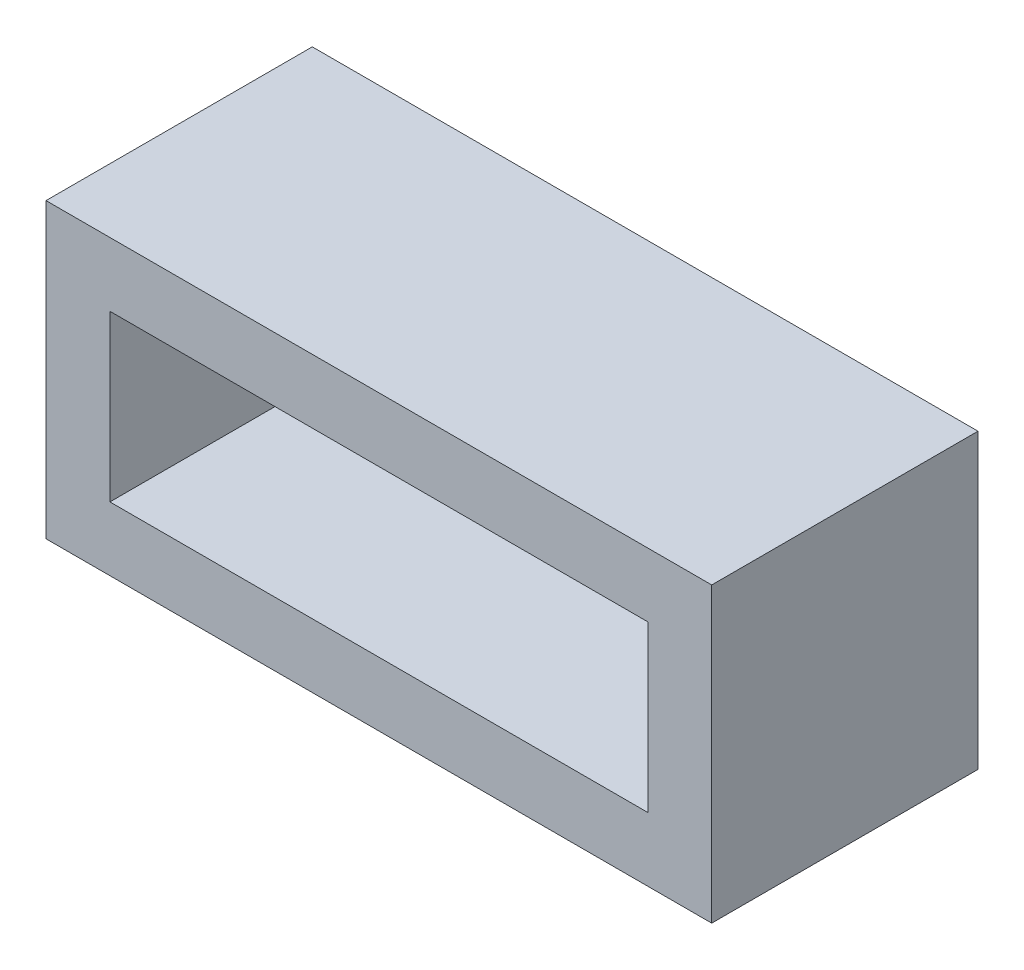
ISO-10303-21;
HEADER;
FILE_DESCRIPTION(('STEP AP214'),'2;1');
FILE_NAME('part.step','',(''),(''),'','','');
FILE_SCHEMA(('AUTOMOTIVE_DESIGN { 1 0 10303 214 1 1 1 1 }'));
ENDSEC;
DATA;
#1=APPLICATION_CONTEXT('core data for automotive mechanical design processes');
#2=APPLICATION_PROTOCOL_DEFINITION('international standard','automotive_design',2000,#1);
#3=PRODUCT_CONTEXT('',#1,'mechanical');
#4=PRODUCT('Part','Part','',(#3));
#5=PRODUCT_RELATED_PRODUCT_CATEGORY('part','',(#4));
#6=PRODUCT_DEFINITION_FORMATION('','',#4);
#7=PRODUCT_DEFINITION_CONTEXT('part definition',#1,'design');
#8=PRODUCT_DEFINITION('design','',#6,#7);
#9=PRODUCT_DEFINITION_SHAPE('','',#8);
#10=(LENGTH_UNIT() NAMED_UNIT(*) SI_UNIT(.MILLI.,.METRE.));
#11=(NAMED_UNIT(*) PLANE_ANGLE_UNIT() SI_UNIT($,.RADIAN.));
#12=(NAMED_UNIT(*) SI_UNIT($,.STERADIAN.) SOLID_ANGLE_UNIT());
#13=UNCERTAINTY_MEASURE_WITH_UNIT(LENGTH_MEASURE(1.E-05),#10,'distance_accuracy_value','');
#14=(GEOMETRIC_REPRESENTATION_CONTEXT(3) GLOBAL_UNCERTAINTY_ASSIGNED_CONTEXT((#13)) GLOBAL_UNIT_ASSIGNED_CONTEXT((#10,
#11,#12)) REPRESENTATION_CONTEXT('',''));
#15=CARTESIAN_POINT('',(0.,0.,0.));
#16=DIRECTION('',(0.,0.,1.));
#17=DIRECTION('',(1.,0.,0.));
#18=AXIS2_PLACEMENT_3D('',#15,#16,#17);
#19=CARTESIAN_POINT('',(0.,0.,10.));
#20=DIRECTION('',(0.,0.,-1.));
#21=DIRECTION('',(-1.,0.,0.));
#22=AXIS2_PLACEMENT_3D('',#19,#20,#21);
#23=PLANE('',#22);
#24=DIRECTION('',(0.,1.,0.));
#25=VECTOR('',#24,1.);
#26=CARTESIAN_POINT('',(12.5,-5.5,10.));
#27=LINE('',#26,#25);
#28=CARTESIAN_POINT('',(12.5,-5.5,10.));
#29=VERTEX_POINT('',#28);
#30=CARTESIAN_POINT('',(12.5,5.5,10.));
#31=VERTEX_POINT('',#30);
#32=EDGE_CURVE('E140',#29,#31,#27,.T.);
#33=ORIENTED_EDGE('',*,*,#32,.T.);
#34=DIRECTION('',(-1.,0.,0.));
#35=VECTOR('',#34,1.);
#36=CARTESIAN_POINT('',(-12.5,5.5,10.));
#37=LINE('',#36,#35);
#38=CARTESIAN_POINT('',(-12.5,5.5,10.));
#39=VERTEX_POINT('',#38);
#40=EDGE_CURVE('E143',#31,#39,#37,.T.);
#41=ORIENTED_EDGE('',*,*,#40,.T.);
#42=DIRECTION('',(0.,-1.,0.));
#43=VECTOR('',#42,1.);
#44=CARTESIAN_POINT('',(-12.5,-5.5,10.));
#45=LINE('',#44,#43);
#46=CARTESIAN_POINT('',(-12.5,-5.5,10.));
#47=VERTEX_POINT('',#46);
#48=EDGE_CURVE('E146',#39,#47,#45,.T.);
#49=ORIENTED_EDGE('',*,*,#48,.T.);
#50=DIRECTION('',(1.,0.,0.));
#51=VECTOR('',#50,1.);
#52=CARTESIAN_POINT('',(-12.5,-5.5,10.));
#53=LINE('',#52,#51);
#54=EDGE_CURVE('E148',#47,#29,#53,.T.);
#55=ORIENTED_EDGE('',*,*,#54,.T.);
#56=EDGE_LOOP('',(#33,#41,#49,#55));
#57=FACE_BOUND('',#56,.T.);
#58=DIRECTION('',(0.,1.,0.));
#59=VECTOR('',#58,1.);
#60=CARTESIAN_POINT('',(10.1,-3.1,10.));
#61=LINE('',#60,#59);
#62=CARTESIAN_POINT('',(10.1,-3.1,10.));
#63=VERTEX_POINT('',#62);
#64=CARTESIAN_POINT('',(10.1,3.1,10.));
#65=VERTEX_POINT('',#64);
#66=EDGE_CURVE('E104',#63,#65,#61,.T.);
#67=ORIENTED_EDGE('',*,*,#66,.F.);
#68=DIRECTION('',(1.,0.,0.));
#69=VECTOR('',#68,1.);
#70=CARTESIAN_POINT('',(-10.1,-3.1,10.));
#71=LINE('',#70,#69);
#72=CARTESIAN_POINT('',(-10.1,-3.1,10.));
#73=VERTEX_POINT('',#72);
#74=EDGE_CURVE('E126',#73,#63,#71,.T.);
#75=ORIENTED_EDGE('',*,*,#74,.F.);
#76=DIRECTION('',(0.,-1.,0.));
#77=VECTOR('',#76,1.);
#78=CARTESIAN_POINT('',(-10.1,-3.1,10.));
#79=LINE('',#78,#77);
#80=CARTESIAN_POINT('',(-10.1,3.1,10.));
#81=VERTEX_POINT('',#80);
#82=EDGE_CURVE('E124',#81,#73,#79,.T.);
#83=ORIENTED_EDGE('',*,*,#82,.F.);
#84=DIRECTION('',(-1.,0.,0.));
#85=VECTOR('',#84,1.);
#86=CARTESIAN_POINT('',(-10.1,3.1,10.));
#87=LINE('',#86,#85);
#88=EDGE_CURVE('E112',#65,#81,#87,.T.);
#89=ORIENTED_EDGE('',*,*,#88,.F.);
#90=EDGE_LOOP('',(#67,#75,#83,#89));
#91=FACE_BOUND('',#90,.T.);
#92=ADVANCED_FACE('F39',(#57,#91),#23,.F.);
#93=CARTESIAN_POINT('',(0.,0.,0.));
#94=DIRECTION('',(0.,0.,-1.));
#95=DIRECTION('',(-1.,0.,0.));
#96=AXIS2_PLACEMENT_3D('',#93,#94,#95);
#97=PLANE('',#96);
#98=DIRECTION('',(0.,1.,0.));
#99=VECTOR('',#98,1.);
#100=CARTESIAN_POINT('',(12.5,-5.5,0.));
#101=LINE('',#100,#99);
#102=CARTESIAN_POINT('',(12.5,-5.5,0.));
#103=VERTEX_POINT('',#102);
#104=CARTESIAN_POINT('',(12.5,5.5,0.));
#105=VERTEX_POINT('',#104);
#106=EDGE_CURVE('E120',#103,#105,#101,.T.);
#107=ORIENTED_EDGE('',*,*,#106,.F.);
#108=DIRECTION('',(1.,0.,0.));
#109=VECTOR('',#108,1.);
#110=CARTESIAN_POINT('',(-12.5,-5.5,0.));
#111=LINE('',#110,#109);
#112=CARTESIAN_POINT('',(-12.5,-5.5,0.));
#113=VERTEX_POINT('',#112);
#114=EDGE_CURVE('E144',#113,#103,#111,.T.);
#115=ORIENTED_EDGE('',*,*,#114,.F.);
#116=DIRECTION('',(0.,-1.,0.));
#117=VECTOR('',#116,1.);
#118=CARTESIAN_POINT('',(-12.5,-5.5,0.));
#119=LINE('',#118,#117);
#120=CARTESIAN_POINT('',(-12.5,5.5,0.));
#121=VERTEX_POINT('',#120);
#122=EDGE_CURVE('E155',#121,#113,#119,.T.);
#123=ORIENTED_EDGE('',*,*,#122,.F.);
#124=DIRECTION('',(-1.,0.,0.));
#125=VECTOR('',#124,1.);
#126=CARTESIAN_POINT('',(-12.5,5.5,0.));
#127=LINE('',#126,#125);
#128=EDGE_CURVE('E153',#105,#121,#127,.T.);
#129=ORIENTED_EDGE('',*,*,#128,.F.);
#130=EDGE_LOOP('',(#107,#115,#123,#129));
#131=FACE_BOUND('',#130,.T.);
#132=DIRECTION('',(1.,0.,0.));
#133=VECTOR('',#132,1.);
#134=CARTESIAN_POINT('',(-10.1,-3.1,0.));
#135=LINE('',#134,#133);
#136=CARTESIAN_POINT('',(-10.1,-3.1,0.));
#137=VERTEX_POINT('',#136);
#138=CARTESIAN_POINT('',(10.1,-3.1,0.));
#139=VERTEX_POINT('',#138);
#140=EDGE_CURVE('E113',#137,#139,#135,.T.);
#141=ORIENTED_EDGE('',*,*,#140,.T.);
#142=DIRECTION('',(0.,1.,0.));
#143=VECTOR('',#142,1.);
#144=CARTESIAN_POINT('',(10.1,-3.1,0.));
#145=LINE('',#144,#143);
#146=CARTESIAN_POINT('',(10.1,3.1,0.));
#147=VERTEX_POINT('',#146);
#148=EDGE_CURVE('E62',#139,#147,#145,.T.);
#149=ORIENTED_EDGE('',*,*,#148,.T.);
#150=DIRECTION('',(-1.,0.,0.));
#151=VECTOR('',#150,1.);
#152=CARTESIAN_POINT('',(-10.1,3.1,0.));
#153=LINE('',#152,#151);
#154=CARTESIAN_POINT('',(-10.1,3.1,0.));
#155=VERTEX_POINT('',#154);
#156=EDGE_CURVE('E119',#147,#155,#153,.T.);
#157=ORIENTED_EDGE('',*,*,#156,.T.);
#158=DIRECTION('',(0.,-1.,0.));
#159=VECTOR('',#158,1.);
#160=CARTESIAN_POINT('',(-10.1,-3.1,0.));
#161=LINE('',#160,#159);
#162=EDGE_CURVE('E132',#155,#137,#161,.T.);
#163=ORIENTED_EDGE('',*,*,#162,.T.);
#164=EDGE_LOOP('',(#141,#149,#157,#163));
#165=FACE_BOUND('',#164,.T.);
#166=ADVANCED_FACE('F173',(#131,#165),#97,.T.);
#167=CARTESIAN_POINT('',(12.5,-5.5,10.));
#168=DIRECTION('',(-1.,0.,0.));
#169=DIRECTION('',(0.,0.,1.));
#170=AXIS2_PLACEMENT_3D('',#167,#168,#169);
#171=PLANE('',#170);
#172=ORIENTED_EDGE('',*,*,#106,.T.);
#173=DIRECTION('',(0.,0.,-1.));
#174=VECTOR('',#173,1.);
#175=CARTESIAN_POINT('',(12.5,5.5,10.));
#176=LINE('',#175,#174);
#177=EDGE_CURVE('E11',#31,#105,#176,.T.);
#178=ORIENTED_EDGE('',*,*,#177,.F.);
#179=ORIENTED_EDGE('',*,*,#32,.F.);
#180=DIRECTION('',(0.,0.,-1.));
#181=VECTOR('',#180,1.);
#182=CARTESIAN_POINT('',(12.5,-5.5,10.));
#183=LINE('',#182,#181);
#184=EDGE_CURVE('E150',#29,#103,#183,.T.);
#185=ORIENTED_EDGE('',*,*,#184,.T.);
#186=EDGE_LOOP('',(#172,#178,#179,#185));
#187=FACE_BOUND('',#186,.T.);
#188=ADVANCED_FACE('F41',(#187),#171,.F.);
#189=CARTESIAN_POINT('',(-12.5,5.5,10.));
#190=DIRECTION('',(0.,-1.,0.));
#191=DIRECTION('',(0.,0.,-1.));
#192=AXIS2_PLACEMENT_3D('',#189,#190,#191);
#193=PLANE('',#192);
#194=ORIENTED_EDGE('',*,*,#128,.T.);
#195=DIRECTION('',(0.,0.,-1.));
#196=VECTOR('',#195,1.);
#197=CARTESIAN_POINT('',(-12.5,5.5,10.));
#198=LINE('',#197,#196);
#199=EDGE_CURVE('E47',#39,#121,#198,.T.);
#200=ORIENTED_EDGE('',*,*,#199,.F.);
#201=ORIENTED_EDGE('',*,*,#40,.F.);
#202=ORIENTED_EDGE('',*,*,#177,.T.);
#203=EDGE_LOOP('',(#194,#200,#201,#202));
#204=FACE_BOUND('',#203,.T.);
#205=ADVANCED_FACE('F183',(#204),#193,.F.);
#206=CARTESIAN_POINT('',(-12.5,-5.5,10.));
#207=DIRECTION('',(1.,0.,0.));
#208=DIRECTION('',(0.,0.,-1.));
#209=AXIS2_PLACEMENT_3D('',#206,#207,#208);
#210=PLANE('',#209);
#211=ORIENTED_EDGE('',*,*,#122,.T.);
#212=DIRECTION('',(0.,0.,-1.));
#213=VECTOR('',#212,1.);
#214=CARTESIAN_POINT('',(-12.5,-5.5,10.));
#215=LINE('',#214,#213);
#216=EDGE_CURVE('E160',#47,#113,#215,.T.);
#217=ORIENTED_EDGE('',*,*,#216,.F.);
#218=ORIENTED_EDGE('',*,*,#48,.F.);
#219=ORIENTED_EDGE('',*,*,#199,.T.);
#220=EDGE_LOOP('',(#211,#217,#218,#219));
#221=FACE_BOUND('',#220,.T.);
#222=ADVANCED_FACE('F167',(#221),#210,.F.);
#223=CARTESIAN_POINT('',(-12.5,-5.5,10.));
#224=DIRECTION('',(0.,1.,0.));
#225=DIRECTION('',(0.,0.,1.));
#226=AXIS2_PLACEMENT_3D('',#223,#224,#225);
#227=PLANE('',#226);
#228=ORIENTED_EDGE('',*,*,#114,.T.);
#229=ORIENTED_EDGE('',*,*,#184,.F.);
#230=ORIENTED_EDGE('',*,*,#54,.F.);
#231=ORIENTED_EDGE('',*,*,#216,.T.);
#232=EDGE_LOOP('',(#228,#229,#230,#231));
#233=FACE_BOUND('',#232,.T.);
#234=ADVANCED_FACE('F177',(#233),#227,.F.);
#235=CARTESIAN_POINT('',(10.1,-3.1,10.));
#236=DIRECTION('',(-1.,0.,0.));
#237=DIRECTION('',(0.,0.,1.));
#238=AXIS2_PLACEMENT_3D('',#235,#236,#237);
#239=PLANE('',#238);
#240=ORIENTED_EDGE('',*,*,#148,.F.);
#241=DIRECTION('',(0.,0.,-1.));
#242=VECTOR('',#241,1.);
#243=CARTESIAN_POINT('',(10.1,-3.1,10.));
#244=LINE('',#243,#242);
#245=EDGE_CURVE('E108',#63,#139,#244,.T.);
#246=ORIENTED_EDGE('',*,*,#245,.F.);
#247=ORIENTED_EDGE('',*,*,#66,.T.);
#248=DIRECTION('',(0.,0.,-1.));
#249=VECTOR('',#248,1.);
#250=CARTESIAN_POINT('',(10.1,3.1,10.));
#251=LINE('',#250,#249);
#252=EDGE_CURVE('E107',#65,#147,#251,.T.);
#253=ORIENTED_EDGE('',*,*,#252,.T.);
#254=EDGE_LOOP('',(#240,#246,#247,#253));
#255=FACE_BOUND('',#254,.T.);
#256=ADVANCED_FACE('F106',(#255),#239,.T.);
#257=CARTESIAN_POINT('',(-10.1,3.1,10.));
#258=DIRECTION('',(0.,-1.,0.));
#259=DIRECTION('',(0.,0.,-1.));
#260=AXIS2_PLACEMENT_3D('',#257,#258,#259);
#261=PLANE('',#260);
#262=ORIENTED_EDGE('',*,*,#156,.F.);
#263=ORIENTED_EDGE('',*,*,#252,.F.);
#264=ORIENTED_EDGE('',*,*,#88,.T.);
#265=DIRECTION('',(0.,0.,-1.));
#266=VECTOR('',#265,1.);
#267=CARTESIAN_POINT('',(-10.1,3.1,10.));
#268=LINE('',#267,#266);
#269=EDGE_CURVE('E121',#81,#155,#268,.T.);
#270=ORIENTED_EDGE('',*,*,#269,.T.);
#271=EDGE_LOOP('',(#262,#263,#264,#270));
#272=FACE_BOUND('',#271,.T.);
#273=ADVANCED_FACE('F116',(#272),#261,.T.);
#274=CARTESIAN_POINT('',(-10.1,-3.1,10.));
#275=DIRECTION('',(1.,0.,0.));
#276=DIRECTION('',(0.,0.,-1.));
#277=AXIS2_PLACEMENT_3D('',#274,#275,#276);
#278=PLANE('',#277);
#279=ORIENTED_EDGE('',*,*,#162,.F.);
#280=ORIENTED_EDGE('',*,*,#269,.F.);
#281=ORIENTED_EDGE('',*,*,#82,.T.);
#282=DIRECTION('',(0.,0.,-1.));
#283=VECTOR('',#282,1.);
#284=CARTESIAN_POINT('',(-10.1,-3.1,10.));
#285=LINE('',#284,#283);
#286=EDGE_CURVE('E54',#73,#137,#285,.T.);
#287=ORIENTED_EDGE('',*,*,#286,.T.);
#288=EDGE_LOOP('',(#279,#280,#281,#287));
#289=FACE_BOUND('',#288,.T.);
#290=ADVANCED_FACE('F206',(#289),#278,.T.);
#291=CARTESIAN_POINT('',(-10.1,-3.1,10.));
#292=DIRECTION('',(0.,1.,0.));
#293=DIRECTION('',(0.,0.,1.));
#294=AXIS2_PLACEMENT_3D('',#291,#292,#293);
#295=PLANE('',#294);
#296=ORIENTED_EDGE('',*,*,#140,.F.);
#297=ORIENTED_EDGE('',*,*,#286,.F.);
#298=ORIENTED_EDGE('',*,*,#74,.T.);
#299=ORIENTED_EDGE('',*,*,#245,.T.);
#300=EDGE_LOOP('',(#296,#297,#298,#299));
#301=FACE_BOUND('',#300,.T.);
#302=ADVANCED_FACE('F210',(#301),#295,.T.);
#303=CLOSED_SHELL('',(#92,#166,#188,#205,#222,#234,#256,#273,#290,#302));
#304=MANIFOLD_SOLID_BREP('B2',#303);
#305=ADVANCED_BREP_SHAPE_REPRESENTATION('',(#18,#304),#14);
#306=SHAPE_DEFINITION_REPRESENTATION(#9,#305);
ENDSEC;
END-ISO-10303-21;
